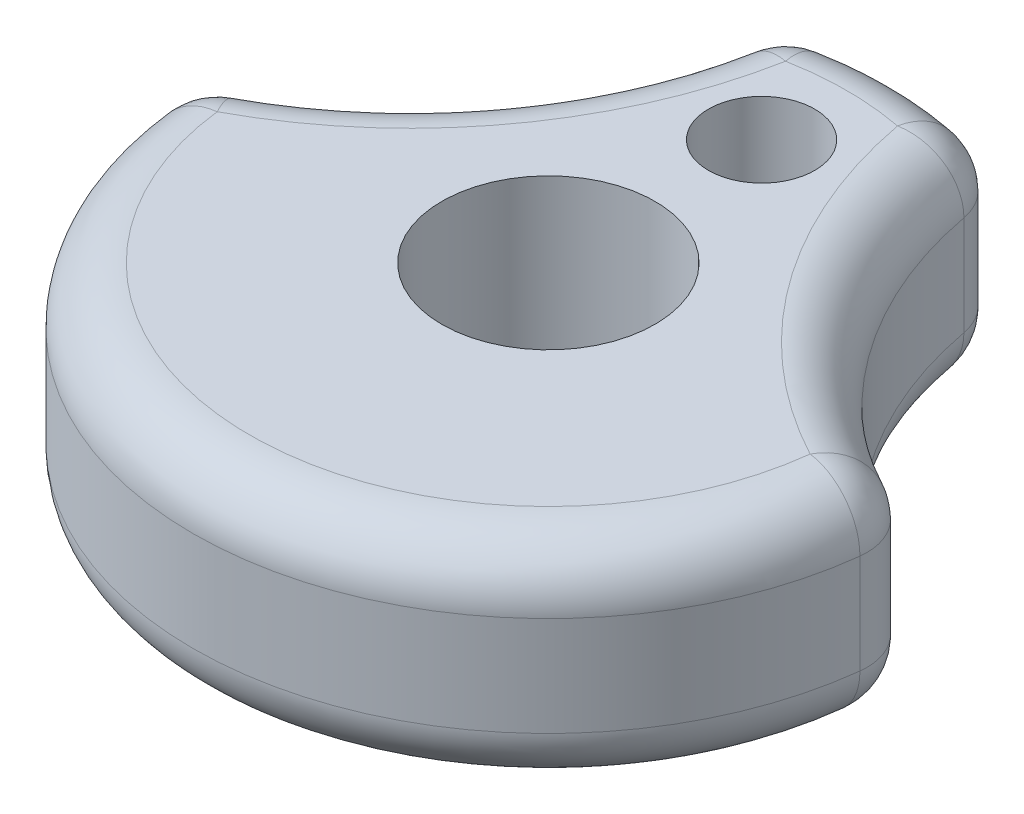
ISO-10303-21;
HEADER;
FILE_DESCRIPTION(('STEP AP214'),'2;1');
FILE_NAME('part.step','',(''),(''),'','','');
FILE_SCHEMA(('AUTOMOTIVE_DESIGN { 1 0 10303 214 1 1 1 1 }'));
ENDSEC;
DATA;
#1=APPLICATION_CONTEXT('core data for automotive mechanical design processes');
#2=APPLICATION_PROTOCOL_DEFINITION('international standard','automotive_design',2000,#1);
#3=PRODUCT_CONTEXT('',#1,'mechanical');
#4=PRODUCT('Part','Part','',(#3));
#5=PRODUCT_RELATED_PRODUCT_CATEGORY('part','',(#4));
#6=PRODUCT_DEFINITION_FORMATION('','',#4);
#7=PRODUCT_DEFINITION_CONTEXT('part definition',#1,'design');
#8=PRODUCT_DEFINITION('design','',#6,#7);
#9=PRODUCT_DEFINITION_SHAPE('','',#8);
#10=(LENGTH_UNIT() NAMED_UNIT(*) SI_UNIT(.MILLI.,.METRE.));
#11=(NAMED_UNIT(*) PLANE_ANGLE_UNIT() SI_UNIT($,.RADIAN.));
#12=(NAMED_UNIT(*) SI_UNIT($,.STERADIAN.) SOLID_ANGLE_UNIT());
#13=UNCERTAINTY_MEASURE_WITH_UNIT(LENGTH_MEASURE(1.E-05),#10,'distance_accuracy_value','');
#14=(GEOMETRIC_REPRESENTATION_CONTEXT(3) GLOBAL_UNCERTAINTY_ASSIGNED_CONTEXT((#13)) GLOBAL_UNIT_ASSIGNED_CONTEXT((#10,
#11,#12)) REPRESENTATION_CONTEXT('',''));
#15=CARTESIAN_POINT('',(0.,0.,0.));
#16=DIRECTION('',(0.,0.,1.));
#17=DIRECTION('',(1.,0.,0.));
#18=AXIS2_PLACEMENT_3D('',#15,#16,#17);
#19=CARTESIAN_POINT('',(-0.455273064420699,0.375,-0.333785450665428));
#20=DIRECTION('',(0.,1.,0.));
#21=DIRECTION('',(0.,0.,1.));
#22=AXIS2_PLACEMENT_3D('',#19,#20,#21);
#23=PLANE('',#22);
#24=CARTESIAN_POINT('',(0.,0.375,0.));
#25=DIRECTION('',(0.,1.,0.));
#26=DIRECTION('',(0.,0.,1.));
#27=AXIS2_PLACEMENT_3D('',#24,#25,#26);
#28=CIRCLE('',#27,0.1875);
#29=CARTESIAN_POINT('',(0.,0.375,0.1875));
#30=VERTEX_POINT('',#29);
#31=EDGE_CURVE('E139',#30,#30,#28,.T.);
#32=ORIENTED_EDGE('',*,*,#31,.F.);
#33=EDGE_LOOP('',(#32));
#34=FACE_BOUND('',#33,.T.);
#35=CARTESIAN_POINT('',(0.910546128841399,0.375,-0.667570901330856));
#36=DIRECTION('',(0.,1.,0.));
#37=DIRECTION('',(0.,0.,1.));
#38=AXIS2_PLACEMENT_3D('',#35,#36,#37);
#39=CIRCLE('',#38,0.82607678657288);
#40=CARTESIAN_POINT('',(0.521430010192761,0.375,0.0611207368278339));
#41=VERTEX_POINT('',#40);
#42=CARTESIAN_POINT('',(0.0985560799891539,0.375,-0.515666267170126));
#43=VERTEX_POINT('',#42);
#44=EDGE_CURVE('E132',#41,#43,#39,.F.);
#45=ORIENTED_EDGE('',*,*,#44,.T.);
#46=CARTESIAN_POINT('',(0.,0.375,0.));
#47=DIRECTION('',(0.,1.,0.));
#48=DIRECTION('',(0.,0.,1.));
#49=AXIS2_PLACEMENT_3D('',#46,#47,#48);
#50=CIRCLE('',#49,0.525);
#51=CARTESIAN_POINT('',(-0.0985560799891541,0.375,-0.515666267170126));
#52=VERTEX_POINT('',#51);
#53=EDGE_CURVE('E220',#43,#52,#50,.T.);
#54=ORIENTED_EDGE('',*,*,#53,.T.);
#55=CARTESIAN_POINT('',(-0.910546128841399,0.375,-0.667570901330856));
#56=DIRECTION('',(0.,1.,0.));
#57=DIRECTION('',(0.,0.,1.));
#58=AXIS2_PLACEMENT_3D('',#55,#56,#57);
#59=CIRCLE('',#58,0.82607678657288);
#60=CARTESIAN_POINT('',(-0.521430010192761,0.375,0.061120736827834));
#61=VERTEX_POINT('',#60);
#62=EDGE_CURVE('E135',#52,#61,#59,.F.);
#63=ORIENTED_EDGE('',*,*,#62,.T.);
#64=CARTESIAN_POINT('',(0.,0.375,0.));
#65=DIRECTION('',(0.,1.,0.));
#66=DIRECTION('',(0.,0.,1.));
#67=AXIS2_PLACEMENT_3D('',#64,#65,#66);
#68=CIRCLE('',#67,0.525);
#69=EDGE_CURVE('E128',#61,#41,#68,.T.);
#70=ORIENTED_EDGE('',*,*,#69,.T.);
#71=EDGE_LOOP('',(#45,#54,#63,#70));
#72=FACE_BOUND('',#71,.T.);
#73=CARTESIAN_POINT('',(0.,0.375,-0.375));
#74=DIRECTION('',(0.,1.,0.));
#75=DIRECTION('',(0.,0.,1.));
#76=AXIS2_PLACEMENT_3D('',#73,#74,#75);
#77=CIRCLE('',#76,0.0935);
#78=CARTESIAN_POINT('',(0.,0.375,-0.2815));
#79=VERTEX_POINT('',#78);
#80=EDGE_CURVE('E317',#79,#79,#77,.T.);
#81=ORIENTED_EDGE('',*,*,#80,.F.);
#82=EDGE_LOOP('',(#81));
#83=FACE_BOUND('',#82,.T.);
#84=ADVANCED_FACE('F38',(#34,#72,#83),#23,.T.);
#85=CARTESIAN_POINT('',(-0.455273064420699,0.,-0.333785450665428));
#86=DIRECTION('',(0.,1.,0.));
#87=DIRECTION('',(0.,0.,1.));
#88=AXIS2_PLACEMENT_3D('',#85,#86,#87);
#89=PLANE('',#88);
#90=CARTESIAN_POINT('',(-0.910546128841399,0.,-0.667570901330856));
#91=DIRECTION('',(0.,1.,0.));
#92=DIRECTION('',(0.,0.,1.));
#93=AXIS2_PLACEMENT_3D('',#90,#91,#92);
#94=CIRCLE('',#93,0.82607678657288);
#95=CARTESIAN_POINT('',(-0.521430010192761,0.,0.0611207368278339));
#96=VERTEX_POINT('',#95);
#97=CARTESIAN_POINT('',(-0.0985560799891539,0.,-0.515666267170126));
#98=VERTEX_POINT('',#97);
#99=EDGE_CURVE('E197',#96,#98,#94,.T.);
#100=ORIENTED_EDGE('',*,*,#99,.T.);
#101=CARTESIAN_POINT('',(0.,0.,0.));
#102=DIRECTION('',(0.,1.,0.));
#103=DIRECTION('',(0.,0.,1.));
#104=AXIS2_PLACEMENT_3D('',#101,#102,#103);
#105=CIRCLE('',#104,0.525);
#106=CARTESIAN_POINT('',(0.0985560799891541,0.,-0.515666267170126));
#107=VERTEX_POINT('',#106);
#108=EDGE_CURVE('E236',#98,#107,#105,.F.);
#109=ORIENTED_EDGE('',*,*,#108,.T.);
#110=CARTESIAN_POINT('',(0.910546128841399,0.,-0.667570901330856));
#111=DIRECTION('',(0.,1.,0.));
#112=DIRECTION('',(0.,0.,1.));
#113=AXIS2_PLACEMENT_3D('',#110,#111,#112);
#114=CIRCLE('',#113,0.82607678657288);
#115=CARTESIAN_POINT('',(0.521430010192761,0.,0.061120736827834));
#116=VERTEX_POINT('',#115);
#117=EDGE_CURVE('E181',#107,#116,#114,.T.);
#118=ORIENTED_EDGE('',*,*,#117,.T.);
#119=CARTESIAN_POINT('',(0.,0.,0.));
#120=DIRECTION('',(0.,1.,0.));
#121=DIRECTION('',(0.,0.,1.));
#122=AXIS2_PLACEMENT_3D('',#119,#120,#121);
#123=CIRCLE('',#122,0.525);
#124=EDGE_CURVE('E165',#116,#96,#123,.F.);
#125=ORIENTED_EDGE('',*,*,#124,.T.);
#126=EDGE_LOOP('',(#100,#109,#118,#125));
#127=FACE_BOUND('',#126,.T.);
#128=CARTESIAN_POINT('',(0.,0.,0.));
#129=DIRECTION('',(0.,1.,0.));
#130=DIRECTION('',(0.,0.,1.));
#131=AXIS2_PLACEMENT_3D('',#128,#129,#130);
#132=CIRCLE('',#131,0.1875);
#133=CARTESIAN_POINT('',(0.,0.,0.1875));
#134=VERTEX_POINT('',#133);
#135=EDGE_CURVE('E314',#134,#134,#132,.T.);
#136=ORIENTED_EDGE('',*,*,#135,.T.);
#137=EDGE_LOOP('',(#136));
#138=FACE_BOUND('',#137,.T.);
#139=CARTESIAN_POINT('',(0.,0.,-0.375));
#140=DIRECTION('',(0.,1.,0.));
#141=DIRECTION('',(0.,0.,1.));
#142=AXIS2_PLACEMENT_3D('',#139,#140,#141);
#143=CIRCLE('',#142,0.0935);
#144=CARTESIAN_POINT('',(0.,0.,-0.2815));
#145=VERTEX_POINT('',#144);
#146=EDGE_CURVE('E191',#145,#145,#143,.T.);
#147=ORIENTED_EDGE('',*,*,#146,.T.);
#148=EDGE_LOOP('',(#147));
#149=FACE_BOUND('',#148,.T.);
#150=ADVANCED_FACE('F291',(#127,#138,#149),#89,.F.);
#151=CARTESIAN_POINT('',(-0.910546128841399,0.375,-0.667570901330856));
#152=DIRECTION('',(0.,-1.,0.));
#153=DIRECTION('',(0.,0.,-1.));
#154=AXIS2_PLACEMENT_3D('',#151,#152,#153);
#155=CYLINDRICAL_SURFACE('',#154,0.72607678657288);
#156=CARTESIAN_POINT('',(-0.910546128841399,0.275,-0.667570901330856));
#157=DIRECTION('',(0.,1.,0.));
#158=DIRECTION('',(0.,0.,1.));
#159=AXIS2_PLACEMENT_3D('',#156,#157,#158);
#160=CIRCLE('',#159,0.72607678657288);
#161=CARTESIAN_POINT('',(-0.568534120243226,0.275,-0.0270903895472082));
#162=VERTEX_POINT('',#161);
#163=CARTESIAN_POINT('',(-0.196850822324297,0.275,-0.534054949267214));
#164=VERTEX_POINT('',#163);
#165=EDGE_CURVE('E182',#162,#164,#160,.T.);
#166=ORIENTED_EDGE('',*,*,#165,.T.);
#167=DIRECTION('',(0.,-1.,0.));
#168=VECTOR('',#167,1.);
#169=CARTESIAN_POINT('',(-0.196850822324297,0.375,-0.534054949267214));
#170=LINE('',#169,#168);
#171=CARTESIAN_POINT('',(-0.196850822324297,0.1,-0.534054949267214));
#172=VERTEX_POINT('',#171);
#173=EDGE_CURVE('E11',#164,#172,#170,.T.);
#174=ORIENTED_EDGE('',*,*,#173,.T.);
#175=CARTESIAN_POINT('',(-0.910546128841399,0.1,-0.667570901330856));
#176=DIRECTION('',(0.,1.,0.));
#177=DIRECTION('',(0.,0.,1.));
#178=AXIS2_PLACEMENT_3D('',#175,#176,#177);
#179=CIRCLE('',#178,0.72607678657288);
#180=CARTESIAN_POINT('',(-0.568534120243226,0.1,-0.027090389547208));
#181=VERTEX_POINT('',#180);
#182=EDGE_CURVE('E195',#172,#181,#179,.F.);
#183=ORIENTED_EDGE('',*,*,#182,.T.);
#184=DIRECTION('',(0.,-1.,0.));
#185=VECTOR('',#184,1.);
#186=CARTESIAN_POINT('',(-0.568534120243226,0.375,-0.027090389547208));
#187=LINE('',#186,#185);
#188=EDGE_CURVE('E193',#181,#162,#187,.F.);
#189=ORIENTED_EDGE('',*,*,#188,.T.);
#190=EDGE_LOOP('',(#166,#174,#183,#189));
#191=FACE_BOUND('',#190,.T.);
#192=ADVANCED_FACE('F303',(#191),#155,.F.);
#193=CARTESIAN_POINT('',(0.,0.375,0.));
#194=DIRECTION('',(0.,-1.,0.));
#195=DIRECTION('',(0.,0.,-1.));
#196=AXIS2_PLACEMENT_3D('',#193,#194,#195);
#197=CYLINDRICAL_SURFACE('',#196,0.625);
#198=CARTESIAN_POINT('',(0.,0.275,0.));
#199=DIRECTION('',(0.,1.,0.));
#200=DIRECTION('',(0.,0.,1.));
#201=AXIS2_PLACEMENT_3D('',#198,#199,#200);
#202=CIRCLE('',#201,0.625);
#203=CARTESIAN_POINT('',(0.620750012134239,0.275,0.0727627819378978));
#204=VERTEX_POINT('',#203);
#205=CARTESIAN_POINT('',(-0.620750012134239,0.275,0.0727627819378975));
#206=VERTEX_POINT('',#205);
#207=EDGE_CURVE('E138',#204,#206,#202,.F.);
#208=ORIENTED_EDGE('',*,*,#207,.T.);
#209=DIRECTION('',(0.,-1.,0.));
#210=VECTOR('',#209,1.);
#211=CARTESIAN_POINT('',(-0.620750012134239,0.375,0.0727627819378978));
#212=LINE('',#211,#210);
#213=CARTESIAN_POINT('',(-0.620750012134239,0.1,0.0727627819378978));
#214=VERTEX_POINT('',#213);
#215=EDGE_CURVE('E201',#206,#214,#212,.T.);
#216=ORIENTED_EDGE('',*,*,#215,.T.);
#217=CARTESIAN_POINT('',(0.,0.1,0.));
#218=DIRECTION('',(0.,1.,0.));
#219=DIRECTION('',(0.,0.,1.));
#220=AXIS2_PLACEMENT_3D('',#217,#218,#219);
#221=CIRCLE('',#220,0.625);
#222=CARTESIAN_POINT('',(0.620750012134239,0.1,0.0727627819378975));
#223=VERTEX_POINT('',#222);
#224=EDGE_CURVE('E171',#214,#223,#221,.T.);
#225=ORIENTED_EDGE('',*,*,#224,.T.);
#226=DIRECTION('',(0.,-1.,0.));
#227=VECTOR('',#226,1.);
#228=CARTESIAN_POINT('',(0.620750012134239,0.375,0.0727627819378978));
#229=LINE('',#228,#227);
#230=EDGE_CURVE('E150',#223,#204,#229,.F.);
#231=ORIENTED_EDGE('',*,*,#230,.T.);
#232=EDGE_LOOP('',(#208,#216,#225,#231));
#233=FACE_BOUND('',#232,.T.);
#234=ADVANCED_FACE('F311',(#233),#197,.T.);
#235=CARTESIAN_POINT('',(0.910546128841399,0.375,-0.667570901330856));
#236=DIRECTION('',(0.,-1.,0.));
#237=DIRECTION('',(0.,0.,-1.));
#238=AXIS2_PLACEMENT_3D('',#235,#236,#237);
#239=CYLINDRICAL_SURFACE('',#238,0.72607678657288);
#240=CARTESIAN_POINT('',(0.910546128841399,0.1,-0.667570901330856));
#241=DIRECTION('',(0.,1.,0.));
#242=DIRECTION('',(0.,0.,1.));
#243=AXIS2_PLACEMENT_3D('',#240,#241,#242);
#244=CIRCLE('',#243,0.72607678657288);
#245=CARTESIAN_POINT('',(0.568534120243226,0.1,-0.0270903895472081));
#246=VERTEX_POINT('',#245);
#247=CARTESIAN_POINT('',(0.196850822324297,0.1,-0.534054949267214));
#248=VERTEX_POINT('',#247);
#249=EDGE_CURVE('E164',#246,#248,#244,.F.);
#250=ORIENTED_EDGE('',*,*,#249,.T.);
#251=DIRECTION('',(0.,-1.,0.));
#252=VECTOR('',#251,1.);
#253=CARTESIAN_POINT('',(0.196850822324297,0.375,-0.534054949267214));
#254=LINE('',#253,#252);
#255=CARTESIAN_POINT('',(0.196850822324297,0.275,-0.534054949267214));
#256=VERTEX_POINT('',#255);
#257=EDGE_CURVE('E232',#248,#256,#254,.F.);
#258=ORIENTED_EDGE('',*,*,#257,.T.);
#259=CARTESIAN_POINT('',(0.910546128841399,0.275,-0.667570901330856));
#260=DIRECTION('',(0.,1.,0.));
#261=DIRECTION('',(0.,0.,1.));
#262=AXIS2_PLACEMENT_3D('',#259,#260,#261);
#263=CIRCLE('',#262,0.72607678657288);
#264=CARTESIAN_POINT('',(0.568534120243226,0.275,-0.0270903895472081));
#265=VERTEX_POINT('',#264);
#266=EDGE_CURVE('E151',#256,#265,#263,.T.);
#267=ORIENTED_EDGE('',*,*,#266,.T.);
#268=DIRECTION('',(0.,-1.,0.));
#269=VECTOR('',#268,1.);
#270=CARTESIAN_POINT('',(0.568534120243226,0.375,-0.027090389547208));
#271=LINE('',#270,#269);
#272=EDGE_CURVE('E168',#265,#246,#271,.T.);
#273=ORIENTED_EDGE('',*,*,#272,.T.);
#274=EDGE_LOOP('',(#250,#258,#267,#273));
#275=FACE_BOUND('',#274,.T.);
#276=ADVANCED_FACE('F275',(#275),#239,.F.);
#277=CARTESIAN_POINT('',(0.,0.375,0.));
#278=DIRECTION('',(0.,-1.,0.));
#279=DIRECTION('',(0.,0.,-1.));
#280=AXIS2_PLACEMENT_3D('',#277,#278,#279);
#281=CYLINDRICAL_SURFACE('',#280,0.625);
#282=DIRECTION('',(0.,-1.,0.));
#283=VECTOR('',#282,1.);
#284=CARTESIAN_POINT('',(-0.117328666653755,0.375,-0.613888413297769));
#285=LINE('',#284,#283);
#286=CARTESIAN_POINT('',(-0.117328666653755,0.1,-0.613888413297769));
#287=VERTEX_POINT('',#286);
#288=CARTESIAN_POINT('',(-0.117328666653755,0.275,-0.613888413297769));
#289=VERTEX_POINT('',#288);
#290=EDGE_CURVE('E222',#287,#289,#285,.F.);
#291=ORIENTED_EDGE('',*,*,#290,.T.);
#292=CARTESIAN_POINT('',(0.,0.275,0.));
#293=DIRECTION('',(0.,1.,0.));
#294=DIRECTION('',(0.,0.,1.));
#295=AXIS2_PLACEMENT_3D('',#292,#293,#294);
#296=CIRCLE('',#295,0.625);
#297=CARTESIAN_POINT('',(0.117328666653755,0.275,-0.613888413297769));
#298=VERTEX_POINT('',#297);
#299=EDGE_CURVE('E228',#289,#298,#296,.F.);
#300=ORIENTED_EDGE('',*,*,#299,.T.);
#301=DIRECTION('',(0.,-1.,0.));
#302=VECTOR('',#301,1.);
#303=CARTESIAN_POINT('',(0.117328666653755,0.375,-0.613888413297769));
#304=LINE('',#303,#302);
#305=CARTESIAN_POINT('',(0.117328666653755,0.1,-0.613888413297769));
#306=VERTEX_POINT('',#305);
#307=EDGE_CURVE('E226',#298,#306,#304,.T.);
#308=ORIENTED_EDGE('',*,*,#307,.T.);
#309=CARTESIAN_POINT('',(0.,0.1,0.));
#310=DIRECTION('',(0.,1.,0.));
#311=DIRECTION('',(0.,0.,1.));
#312=AXIS2_PLACEMENT_3D('',#309,#310,#311);
#313=CIRCLE('',#312,0.625);
#314=EDGE_CURVE('E224',#306,#287,#313,.T.);
#315=ORIENTED_EDGE('',*,*,#314,.T.);
#316=EDGE_LOOP('',(#291,#300,#308,#315));
#317=FACE_BOUND('',#316,.T.);
#318=ADVANCED_FACE('F339',(#317),#281,.T.);
#319=CARTESIAN_POINT('',(0.,0.375,0.));
#320=DIRECTION('',(0.,-1.,0.));
#321=DIRECTION('',(0.,0.,-1.));
#322=AXIS2_PLACEMENT_3D('',#319,#320,#321);
#323=CYLINDRICAL_SURFACE('',#322,0.1875);
#324=ORIENTED_EDGE('',*,*,#31,.T.);
#325=EDGE_LOOP('',(#324));
#326=FACE_BOUND('',#325,.T.);
#327=ORIENTED_EDGE('',*,*,#135,.F.);
#328=EDGE_LOOP('',(#327));
#329=FACE_BOUND('',#328,.T.);
#330=ADVANCED_FACE('F336',(#326,#329),#323,.F.);
#331=CARTESIAN_POINT('',(0.,0.375,-0.375));
#332=DIRECTION('',(0.,-1.,0.));
#333=DIRECTION('',(0.,0.,-1.));
#334=AXIS2_PLACEMENT_3D('',#331,#332,#333);
#335=CYLINDRICAL_SURFACE('',#334,0.0935);
#336=ORIENTED_EDGE('',*,*,#80,.T.);
#337=EDGE_LOOP('',(#336));
#338=FACE_BOUND('',#337,.T.);
#339=ORIENTED_EDGE('',*,*,#146,.F.);
#340=EDGE_LOOP('',(#339));
#341=FACE_BOUND('',#340,.T.);
#342=ADVANCED_FACE('F325',(#338,#341),#335,.F.);
#343=CARTESIAN_POINT('',(0.,0.275,0.));
#344=DIRECTION('',(0.,1.,0.));
#345=DIRECTION('',(0.,0.,1.));
#346=AXIS2_PLACEMENT_3D('',#343,#344,#345);
#347=TOROIDAL_SURFACE('',#346,0.525,0.1);
#348=ORIENTED_EDGE('',*,*,#69,.F.);
#349=CARTESIAN_POINT('',(-0.521430010192761,0.275,0.0611207368278339));
#350=DIRECTION('',(0.116420451100636,0.,0.993200019414783));
#351=DIRECTION('',(0.993200019414783,0.,-0.116420451100636));
#352=AXIS2_PLACEMENT_3D('',#349,#350,#351);
#353=CIRCLE('',#352,0.1);
#354=EDGE_CURVE('E203',#61,#206,#353,.T.);
#355=ORIENTED_EDGE('',*,*,#354,.T.);
#356=ORIENTED_EDGE('',*,*,#207,.F.);
#357=CARTESIAN_POINT('',(0.521430010192761,0.275,0.0611207368278339));
#358=DIRECTION('',(0.116420451100636,0.,-0.993200019414783));
#359=DIRECTION('',(-0.993200019414783,0.,-0.116420451100636));
#360=AXIS2_PLACEMENT_3D('',#357,#358,#359);
#361=CIRCLE('',#360,0.1);
#362=EDGE_CURVE('E143',#204,#41,#361,.F.);
#363=ORIENTED_EDGE('',*,*,#362,.T.);
#364=EDGE_LOOP('',(#348,#355,#356,#363));
#365=FACE_BOUND('',#364,.T.);
#366=ADVANCED_FACE('F145',(#365),#347,.T.);
#367=CARTESIAN_POINT('',(0.,0.1,0.));
#368=DIRECTION('',(0.,1.,0.));
#369=DIRECTION('',(0.,0.,1.));
#370=AXIS2_PLACEMENT_3D('',#367,#368,#369);
#371=TOROIDAL_SURFACE('',#370,0.525,0.1);
#372=ORIENTED_EDGE('',*,*,#224,.F.);
#373=CARTESIAN_POINT('',(-0.521430010192761,0.1,0.0611207368278339));
#374=DIRECTION('',(0.116420451100636,0.,0.993200019414783));
#375=DIRECTION('',(0.993200019414783,0.,-0.116420451100636));
#376=AXIS2_PLACEMENT_3D('',#373,#374,#375);
#377=CIRCLE('',#376,0.1);
#378=EDGE_CURVE('E199',#214,#96,#377,.T.);
#379=ORIENTED_EDGE('',*,*,#378,.T.);
#380=ORIENTED_EDGE('',*,*,#124,.F.);
#381=CARTESIAN_POINT('',(0.521430010192761,0.1,0.0611207368278339));
#382=DIRECTION('',(0.116420451100636,0.,-0.993200019414783));
#383=DIRECTION('',(-0.993200019414783,0.,-0.116420451100636));
#384=AXIS2_PLACEMENT_3D('',#381,#382,#383);
#385=CIRCLE('',#384,0.1);
#386=EDGE_CURVE('E178',#116,#223,#385,.F.);
#387=ORIENTED_EDGE('',*,*,#386,.T.);
#388=EDGE_LOOP('',(#372,#379,#380,#387));
#389=FACE_BOUND('',#388,.T.);
#390=ADVANCED_FACE('F287',(#389),#371,.T.);
#391=CARTESIAN_POINT('',(0.910546128841399,0.1,-0.667570901330856));
#392=DIRECTION('',(0.,1.,0.));
#393=DIRECTION('',(0.,0.,1.));
#394=AXIS2_PLACEMENT_3D('',#391,#392,#393);
#395=TOROIDAL_SURFACE('',#394,0.82607678657288,0.1);
#396=ORIENTED_EDGE('',*,*,#117,.F.);
#397=CARTESIAN_POINT('',(0.0985560799891539,0.1,-0.515666267170126));
#398=DIRECTION('',(0.183886820970884,0.,0.982947423351433));
#399=DIRECTION('',(0.982947423351433,0.,-0.183886820970884));
#400=AXIS2_PLACEMENT_3D('',#397,#398,#399);
#401=CIRCLE('',#400,0.1);
#402=EDGE_CURVE('E234',#107,#248,#401,.T.);
#403=ORIENTED_EDGE('',*,*,#402,.T.);
#404=ORIENTED_EDGE('',*,*,#249,.F.);
#405=CARTESIAN_POINT('',(0.521430010192761,0.1,0.061120736827834));
#406=DIRECTION('',(0.882111263750421,0.,0.471041100504654));
#407=DIRECTION('',(0.471041100504654,0.,-0.882111263750421));
#408=AXIS2_PLACEMENT_3D('',#405,#406,#407);
#409=CIRCLE('',#408,0.1);
#410=EDGE_CURVE('E188',#116,#246,#409,.T.);
#411=ORIENTED_EDGE('',*,*,#410,.F.);
#412=EDGE_LOOP('',(#396,#403,#404,#411));
#413=FACE_BOUND('',#412,.T.);
#414=ADVANCED_FACE('F272',(#413),#395,.T.);
#415=CARTESIAN_POINT('',(0.521430010192761,0.1,0.0611207368278339));
#416=DIRECTION('',(-0.471041100504654,0.,0.882111263750421));
#417=DIRECTION('',(0.882111263750421,0.,0.471041100504654));
#418=AXIS2_PLACEMENT_3D('',#415,#416,#417);
#419=SPHERICAL_SURFACE('',#418,0.1);
#420=ORIENTED_EDGE('',*,*,#386,.F.);
#421=ORIENTED_EDGE('',*,*,#410,.T.);
#422=CARTESIAN_POINT('',(0.521430010192761,0.1,0.0611207368278339));
#423=DIRECTION('',(0.,1.,0.));
#424=DIRECTION('',(0.,0.,1.));
#425=AXIS2_PLACEMENT_3D('',#422,#423,#424);
#426=CIRCLE('',#425,0.1);
#427=EDGE_CURVE('E185',#223,#246,#426,.T.);
#428=ORIENTED_EDGE('',*,*,#427,.F.);
#429=EDGE_LOOP('',(#420,#421,#428));
#430=FACE_BOUND('',#429,.T.);
#431=ADVANCED_FACE('F283',(#430),#419,.T.);
#432=CARTESIAN_POINT('',(0.521430010192761,0.375,0.0611207368278341));
#433=DIRECTION('',(0.,1.,0.));
#434=DIRECTION('',(0.,0.,1.));
#435=AXIS2_PLACEMENT_3D('',#432,#433,#434);
#436=CYLINDRICAL_SURFACE('',#435,0.1);
#437=CARTESIAN_POINT('',(0.521430010192761,0.275,0.0611207368278341));
#438=DIRECTION('',(0.,1.,0.));
#439=DIRECTION('',(0.,0.,1.));
#440=AXIS2_PLACEMENT_3D('',#437,#438,#439);
#441=CIRCLE('',#440,0.1);
#442=EDGE_CURVE('E156',#204,#265,#441,.T.);
#443=ORIENTED_EDGE('',*,*,#442,.F.);
#444=ORIENTED_EDGE('',*,*,#230,.F.);
#445=ORIENTED_EDGE('',*,*,#427,.T.);
#446=ORIENTED_EDGE('',*,*,#272,.F.);
#447=EDGE_LOOP('',(#443,#444,#445,#446));
#448=FACE_BOUND('',#447,.T.);
#449=ADVANCED_FACE('F278',(#448),#436,.T.);
#450=CARTESIAN_POINT('',(0.521430010192761,0.275,0.0611207368278339));
#451=DIRECTION('',(-0.471041100504654,0.,0.882111263750421));
#452=DIRECTION('',(0.882111263750421,0.,0.471041100504654));
#453=AXIS2_PLACEMENT_3D('',#450,#451,#452);
#454=SPHERICAL_SURFACE('',#453,0.1);
#455=ORIENTED_EDGE('',*,*,#362,.F.);
#456=ORIENTED_EDGE('',*,*,#442,.T.);
#457=CARTESIAN_POINT('',(0.521430010192761,0.275,0.0611207368278339));
#458=DIRECTION('',(-0.88211126375042,0.,-0.471041100504655));
#459=DIRECTION('',(-0.471041100504655,0.,0.882111263750421));
#460=AXIS2_PLACEMENT_3D('',#457,#458,#459);
#461=CIRCLE('',#460,0.1);
#462=EDGE_CURVE('E154',#41,#265,#461,.T.);
#463=ORIENTED_EDGE('',*,*,#462,.F.);
#464=EDGE_LOOP('',(#455,#456,#463));
#465=FACE_BOUND('',#464,.T.);
#466=ADVANCED_FACE('F155',(#465),#454,.T.);
#467=CARTESIAN_POINT('',(0.910546128841399,0.275,-0.667570901330856));
#468=DIRECTION('',(0.,1.,0.));
#469=DIRECTION('',(0.,0.,1.));
#470=AXIS2_PLACEMENT_3D('',#467,#468,#469);
#471=TOROIDAL_SURFACE('',#470,0.82607678657288,0.1);
#472=ORIENTED_EDGE('',*,*,#266,.F.);
#473=CARTESIAN_POINT('',(0.0985560799891539,0.275,-0.515666267170126));
#474=DIRECTION('',(0.183886820970884,0.,0.982947423351433));
#475=DIRECTION('',(0.982947423351433,0.,-0.183886820970884));
#476=AXIS2_PLACEMENT_3D('',#473,#474,#475);
#477=CIRCLE('',#476,0.1);
#478=EDGE_CURVE('E163',#256,#43,#477,.T.);
#479=ORIENTED_EDGE('',*,*,#478,.T.);
#480=ORIENTED_EDGE('',*,*,#44,.F.);
#481=ORIENTED_EDGE('',*,*,#462,.T.);
#482=EDGE_LOOP('',(#472,#479,#480,#481));
#483=FACE_BOUND('',#482,.T.);
#484=ADVANCED_FACE('F161',(#483),#471,.T.);
#485=CARTESIAN_POINT('',(-0.910546128841399,0.275,-0.667570901330856));
#486=DIRECTION('',(0.,1.,0.));
#487=DIRECTION('',(0.,0.,1.));
#488=AXIS2_PLACEMENT_3D('',#485,#486,#487);
#489=TOROIDAL_SURFACE('',#488,0.82607678657288,0.1);
#490=ORIENTED_EDGE('',*,*,#62,.F.);
#491=CARTESIAN_POINT('',(-0.0985560799891539,0.275,-0.515666267170126));
#492=DIRECTION('',(0.183886820970884,0.,-0.982947423351433));
#493=DIRECTION('',(-0.982947423351433,0.,-0.183886820970884));
#494=AXIS2_PLACEMENT_3D('',#491,#492,#493);
#495=CIRCLE('',#494,0.1);
#496=EDGE_CURVE('E206',#52,#164,#495,.F.);
#497=ORIENTED_EDGE('',*,*,#496,.T.);
#498=ORIENTED_EDGE('',*,*,#165,.F.);
#499=CARTESIAN_POINT('',(-0.521430010192761,0.275,0.061120736827834));
#500=DIRECTION('',(-0.882111263750421,0.,0.471041100504654));
#501=DIRECTION('',(0.471041100504654,0.,0.882111263750421));
#502=AXIS2_PLACEMENT_3D('',#499,#500,#501);
#503=CIRCLE('',#502,0.1);
#504=EDGE_CURVE('E159',#61,#162,#503,.T.);
#505=ORIENTED_EDGE('',*,*,#504,.F.);
#506=EDGE_LOOP('',(#490,#497,#498,#505));
#507=FACE_BOUND('',#506,.T.);
#508=ADVANCED_FACE('F305',(#507),#489,.T.);
#509=CARTESIAN_POINT('',(-0.521430010192761,0.275,0.0611207368278339));
#510=DIRECTION('',(0.471041100504654,0.,0.882111263750421));
#511=DIRECTION('',(0.882111263750421,0.,-0.471041100504654));
#512=AXIS2_PLACEMENT_3D('',#509,#510,#511);
#513=SPHERICAL_SURFACE('',#512,0.1);
#514=ORIENTED_EDGE('',*,*,#354,.F.);
#515=ORIENTED_EDGE('',*,*,#504,.T.);
#516=CARTESIAN_POINT('',(-0.521430010192761,0.275,0.0611207368278339));
#517=DIRECTION('',(0.,-1.,0.));
#518=DIRECTION('',(0.,0.,-1.));
#519=AXIS2_PLACEMENT_3D('',#516,#517,#518);
#520=CIRCLE('',#519,0.1);
#521=EDGE_CURVE('E213',#206,#162,#520,.T.);
#522=ORIENTED_EDGE('',*,*,#521,.F.);
#523=EDGE_LOOP('',(#514,#515,#522));
#524=FACE_BOUND('',#523,.T.);
#525=ADVANCED_FACE('F309',(#524),#513,.T.);
#526=CARTESIAN_POINT('',(-0.521430010192761,0.375,0.0611207368278341));
#527=DIRECTION('',(0.,1.,0.));
#528=DIRECTION('',(0.,0.,1.));
#529=AXIS2_PLACEMENT_3D('',#526,#527,#528);
#530=CYLINDRICAL_SURFACE('',#529,0.1);
#531=CARTESIAN_POINT('',(-0.521430010192761,0.1,0.0611207368278342));
#532=DIRECTION('',(0.,-1.,0.));
#533=DIRECTION('',(0.,0.,-1.));
#534=AXIS2_PLACEMENT_3D('',#531,#532,#533);
#535=CIRCLE('',#534,0.1);
#536=EDGE_CURVE('E210',#214,#181,#535,.T.);
#537=ORIENTED_EDGE('',*,*,#536,.F.);
#538=ORIENTED_EDGE('',*,*,#215,.F.);
#539=ORIENTED_EDGE('',*,*,#521,.T.);
#540=ORIENTED_EDGE('',*,*,#188,.F.);
#541=EDGE_LOOP('',(#537,#538,#539,#540));
#542=FACE_BOUND('',#541,.T.);
#543=ADVANCED_FACE('F300',(#542),#530,.T.);
#544=CARTESIAN_POINT('',(-0.521430010192761,0.1,0.0611207368278339));
#545=DIRECTION('',(0.471041100504654,0.,0.882111263750421));
#546=DIRECTION('',(0.882111263750421,0.,-0.471041100504654));
#547=AXIS2_PLACEMENT_3D('',#544,#545,#546);
#548=SPHERICAL_SURFACE('',#547,0.1);
#549=ORIENTED_EDGE('',*,*,#378,.F.);
#550=ORIENTED_EDGE('',*,*,#536,.T.);
#551=CARTESIAN_POINT('',(-0.521430010192761,0.1,0.0611207368278339));
#552=DIRECTION('',(0.882111263750421,0.,-0.471041100504654));
#553=DIRECTION('',(-0.471041100504654,0.,-0.882111263750421));
#554=AXIS2_PLACEMENT_3D('',#551,#552,#553);
#555=CIRCLE('',#554,0.1);
#556=EDGE_CURVE('E207',#96,#181,#555,.T.);
#557=ORIENTED_EDGE('',*,*,#556,.F.);
#558=EDGE_LOOP('',(#549,#550,#557));
#559=FACE_BOUND('',#558,.T.);
#560=ADVANCED_FACE('F296',(#559),#548,.T.);
#561=CARTESIAN_POINT('',(-0.910546128841399,0.1,-0.667570901330856));
#562=DIRECTION('',(0.,1.,0.));
#563=DIRECTION('',(0.,0.,1.));
#564=AXIS2_PLACEMENT_3D('',#561,#562,#563);
#565=TOROIDAL_SURFACE('',#564,0.82607678657288,0.1);
#566=ORIENTED_EDGE('',*,*,#182,.F.);
#567=CARTESIAN_POINT('',(-0.0985560799891539,0.1,-0.515666267170126));
#568=DIRECTION('',(0.183886820970884,0.,-0.982947423351433));
#569=DIRECTION('',(-0.982947423351433,0.,-0.183886820970884));
#570=AXIS2_PLACEMENT_3D('',#567,#568,#569);
#571=CIRCLE('',#570,0.1);
#572=EDGE_CURVE('E47',#172,#98,#571,.F.);
#573=ORIENTED_EDGE('',*,*,#572,.T.);
#574=ORIENTED_EDGE('',*,*,#99,.F.);
#575=ORIENTED_EDGE('',*,*,#556,.T.);
#576=EDGE_LOOP('',(#566,#573,#574,#575));
#577=FACE_BOUND('',#576,.T.);
#578=ADVANCED_FACE('F294',(#577),#565,.T.);
#579=CARTESIAN_POINT('',(0.0985560799891539,0.1,-0.515666267170126));
#580=DIRECTION('',(-0.187725866646008,0.,0.98222146127643));
#581=DIRECTION('',(0.98222146127643,0.,0.187725866646008));
#582=AXIS2_PLACEMENT_3D('',#579,#580,#581);
#583=SPHERICAL_SURFACE('',#582,0.1);
#584=CARTESIAN_POINT('',(0.0985560799891539,0.1,-0.515666267170126));
#585=DIRECTION('',(0.,1.,0.));
#586=DIRECTION('',(0.,0.,1.));
#587=AXIS2_PLACEMENT_3D('',#584,#585,#586);
#588=CIRCLE('',#587,0.1);
#589=EDGE_CURVE('E254',#248,#306,#588,.T.);
#590=ORIENTED_EDGE('',*,*,#589,.F.);
#591=ORIENTED_EDGE('',*,*,#402,.F.);
#592=CARTESIAN_POINT('',(0.0985560799891539,0.1,-0.515666267170126));
#593=DIRECTION('',(-0.98222146127643,0.,-0.187725866646007));
#594=DIRECTION('',(-0.187725866646007,0.,0.98222146127643));
#595=AXIS2_PLACEMENT_3D('',#592,#593,#594);
#596=CIRCLE('',#595,0.1);
#597=EDGE_CURVE('E42',#306,#107,#596,.T.);
#598=ORIENTED_EDGE('',*,*,#597,.F.);
#599=EDGE_LOOP('',(#590,#591,#598));
#600=FACE_BOUND('',#599,.T.);
#601=ADVANCED_FACE('F40',(#600),#583,.T.);
#602=CARTESIAN_POINT('',(0.,0.1,0.));
#603=DIRECTION('',(0.,1.,0.));
#604=DIRECTION('',(0.,0.,1.));
#605=AXIS2_PLACEMENT_3D('',#602,#603,#604);
#606=TOROIDAL_SURFACE('',#605,0.525,0.1);
#607=ORIENTED_EDGE('',*,*,#597,.T.);
#608=ORIENTED_EDGE('',*,*,#108,.F.);
#609=CARTESIAN_POINT('',(-0.0985560799891539,0.1,-0.515666267170126));
#610=DIRECTION('',(-0.98222146127643,0.,0.187725866646008));
#611=DIRECTION('',(0.187725866646008,0.,0.98222146127643));
#612=AXIS2_PLACEMENT_3D('',#609,#610,#611);
#613=CIRCLE('',#612,0.1);
#614=EDGE_CURVE('E252',#287,#98,#613,.T.);
#615=ORIENTED_EDGE('',*,*,#614,.F.);
#616=ORIENTED_EDGE('',*,*,#314,.F.);
#617=EDGE_LOOP('',(#607,#608,#615,#616));
#618=FACE_BOUND('',#617,.T.);
#619=ADVANCED_FACE('F265',(#618),#606,.T.);
#620=CARTESIAN_POINT('',(0.0985560799891539,0.375,-0.515666267170126));
#621=DIRECTION('',(0.,1.,0.));
#622=DIRECTION('',(0.,0.,1.));
#623=AXIS2_PLACEMENT_3D('',#620,#621,#622);
#624=CYLINDRICAL_SURFACE('',#623,0.1);
#625=ORIENTED_EDGE('',*,*,#589,.T.);
#626=ORIENTED_EDGE('',*,*,#307,.F.);
#627=CARTESIAN_POINT('',(0.0985560799891541,0.275,-0.515666267170126));
#628=DIRECTION('',(0.,1.,0.));
#629=DIRECTION('',(0.,0.,1.));
#630=AXIS2_PLACEMENT_3D('',#627,#628,#629);
#631=CIRCLE('',#630,0.1);
#632=EDGE_CURVE('E249',#256,#298,#631,.T.);
#633=ORIENTED_EDGE('',*,*,#632,.F.);
#634=ORIENTED_EDGE('',*,*,#257,.F.);
#635=EDGE_LOOP('',(#625,#626,#633,#634));
#636=FACE_BOUND('',#635,.T.);
#637=ADVANCED_FACE('F392',(#636),#624,.T.);
#638=CARTESIAN_POINT('',(-0.0985560799891539,0.1,-0.515666267170126));
#639=DIRECTION('',(0.187725866646008,0.,0.98222146127643));
#640=DIRECTION('',(0.98222146127643,0.,-0.187725866646008));
#641=AXIS2_PLACEMENT_3D('',#638,#639,#640);
#642=SPHERICAL_SURFACE('',#641,0.1);
#643=ORIENTED_EDGE('',*,*,#614,.T.);
#644=ORIENTED_EDGE('',*,*,#572,.F.);
#645=CARTESIAN_POINT('',(-0.0985560799891539,0.1,-0.515666267170126));
#646=DIRECTION('',(0.,1.,0.));
#647=DIRECTION('',(0.,0.,1.));
#648=AXIS2_PLACEMENT_3D('',#645,#646,#647);
#649=CIRCLE('',#648,0.1);
#650=EDGE_CURVE('E246',#287,#172,#649,.T.);
#651=ORIENTED_EDGE('',*,*,#650,.F.);
#652=EDGE_LOOP('',(#643,#644,#651));
#653=FACE_BOUND('',#652,.T.);
#654=ADVANCED_FACE('F388',(#653),#642,.T.);
#655=CARTESIAN_POINT('',(0.0985560799891539,0.275,-0.515666267170126));
#656=DIRECTION('',(-0.187725866646008,0.,0.98222146127643));
#657=DIRECTION('',(0.98222146127643,0.,0.187725866646008));
#658=AXIS2_PLACEMENT_3D('',#655,#656,#657);
#659=SPHERICAL_SURFACE('',#658,0.1);
#660=ORIENTED_EDGE('',*,*,#478,.F.);
#661=ORIENTED_EDGE('',*,*,#632,.T.);
#662=CARTESIAN_POINT('',(0.098556079989154,0.275,-0.515666267170126));
#663=DIRECTION('',(-0.98222146127643,0.,-0.187725866646007));
#664=DIRECTION('',(-0.187725866646007,0.,0.98222146127643));
#665=AXIS2_PLACEMENT_3D('',#662,#663,#664);
#666=CIRCLE('',#665,0.1);
#667=EDGE_CURVE('E244',#43,#298,#666,.T.);
#668=ORIENTED_EDGE('',*,*,#667,.F.);
#669=EDGE_LOOP('',(#660,#661,#668));
#670=FACE_BOUND('',#669,.T.);
#671=ADVANCED_FACE('F384',(#670),#659,.T.);
#672=CARTESIAN_POINT('',(-0.098556079989154,0.375,-0.515666267170126));
#673=DIRECTION('',(0.,1.,0.));
#674=DIRECTION('',(0.,0.,1.));
#675=AXIS2_PLACEMENT_3D('',#672,#673,#674);
#676=CYLINDRICAL_SURFACE('',#675,0.1);
#677=ORIENTED_EDGE('',*,*,#650,.T.);
#678=ORIENTED_EDGE('',*,*,#173,.F.);
#679=CARTESIAN_POINT('',(-0.098556079989154,0.275,-0.515666267170126));
#680=DIRECTION('',(0.,1.,0.));
#681=DIRECTION('',(0.,0.,1.));
#682=AXIS2_PLACEMENT_3D('',#679,#680,#681);
#683=CIRCLE('',#682,0.1);
#684=EDGE_CURVE('E242',#289,#164,#683,.T.);
#685=ORIENTED_EDGE('',*,*,#684,.F.);
#686=ORIENTED_EDGE('',*,*,#290,.F.);
#687=EDGE_LOOP('',(#677,#678,#685,#686));
#688=FACE_BOUND('',#687,.T.);
#689=ADVANCED_FACE('F380',(#688),#676,.T.);
#690=CARTESIAN_POINT('',(0.,0.275,0.));
#691=DIRECTION('',(0.,1.,0.));
#692=DIRECTION('',(0.,0.,1.));
#693=AXIS2_PLACEMENT_3D('',#690,#691,#692);
#694=TOROIDAL_SURFACE('',#693,0.525,0.1);
#695=ORIENTED_EDGE('',*,*,#667,.T.);
#696=ORIENTED_EDGE('',*,*,#299,.F.);
#697=CARTESIAN_POINT('',(-0.0985560799891539,0.275,-0.515666267170126));
#698=DIRECTION('',(-0.98222146127643,0.,0.187725866646007));
#699=DIRECTION('',(0.187725866646007,0.,0.98222146127643));
#700=AXIS2_PLACEMENT_3D('',#697,#698,#699);
#701=CIRCLE('',#700,0.1);
#702=EDGE_CURVE('E239',#52,#289,#701,.T.);
#703=ORIENTED_EDGE('',*,*,#702,.F.);
#704=ORIENTED_EDGE('',*,*,#53,.F.);
#705=EDGE_LOOP('',(#695,#696,#703,#704));
#706=FACE_BOUND('',#705,.T.);
#707=ADVANCED_FACE('F376',(#706),#694,.T.);
#708=CARTESIAN_POINT('',(-0.0985560799891539,0.275,-0.515666267170126));
#709=DIRECTION('',(0.187725866646008,0.,0.98222146127643));
#710=DIRECTION('',(0.98222146127643,0.,-0.187725866646008));
#711=AXIS2_PLACEMENT_3D('',#708,#709,#710);
#712=SPHERICAL_SURFACE('',#711,0.1);
#713=ORIENTED_EDGE('',*,*,#684,.T.);
#714=ORIENTED_EDGE('',*,*,#496,.F.);
#715=ORIENTED_EDGE('',*,*,#702,.T.);
#716=EDGE_LOOP('',(#713,#714,#715));
#717=FACE_BOUND('',#716,.T.);
#718=ADVANCED_FACE('F373',(#717),#712,.T.);
#719=CLOSED_SHELL('',(#84,#150,#192,#234,#276,#318,#330,#342,#366,#390,#414,#431,#449,#466,#484,
#508,#525,#543,#560,#578,#601,#619,#637,#654,#671,#689,#707,#718));
#720=MANIFOLD_SOLID_BREP('B2',#719);
#721=ADVANCED_BREP_SHAPE_REPRESENTATION('',(#18,#720),#14);
#722=SHAPE_DEFINITION_REPRESENTATION(#9,#721);
ENDSEC;
END-ISO-10303-21;
